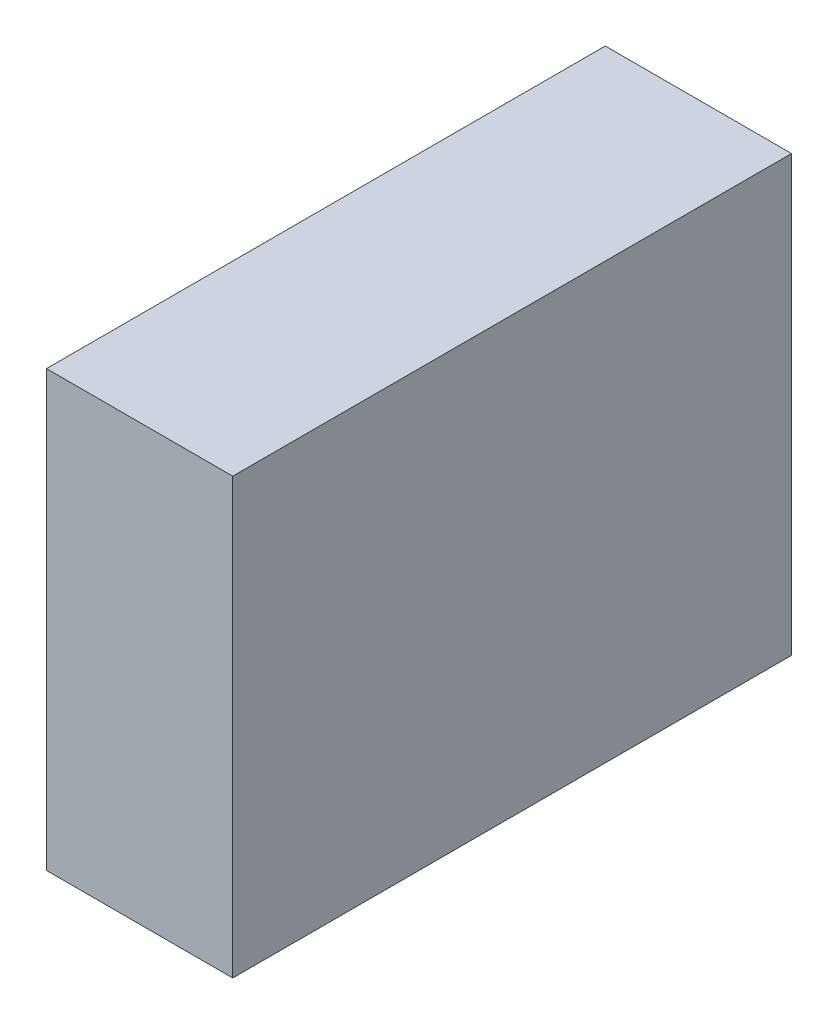
ISO-10303-21;
HEADER;
FILE_DESCRIPTION(('STEP AP214'),'2;1');
FILE_NAME('part.step','',(''),(''),'','','');
FILE_SCHEMA(('AUTOMOTIVE_DESIGN { 1 0 10303 214 1 1 1 1 }'));
ENDSEC;
DATA;
#1=APPLICATION_CONTEXT('core data for automotive mechanical design processes');
#2=APPLICATION_PROTOCOL_DEFINITION('international standard','automotive_design',2000,#1);
#3=PRODUCT_CONTEXT('',#1,'mechanical');
#4=PRODUCT('Part','Part','',(#3));
#5=PRODUCT_RELATED_PRODUCT_CATEGORY('part','',(#4));
#6=PRODUCT_DEFINITION_FORMATION('','',#4);
#7=PRODUCT_DEFINITION_CONTEXT('part definition',#1,'design');
#8=PRODUCT_DEFINITION('design','',#6,#7);
#9=PRODUCT_DEFINITION_SHAPE('','',#8);
#10=(LENGTH_UNIT() NAMED_UNIT(*) SI_UNIT(.MILLI.,.METRE.));
#11=(NAMED_UNIT(*) PLANE_ANGLE_UNIT() SI_UNIT($,.RADIAN.));
#12=(NAMED_UNIT(*) SI_UNIT($,.STERADIAN.) SOLID_ANGLE_UNIT());
#13=UNCERTAINTY_MEASURE_WITH_UNIT(LENGTH_MEASURE(1.E-05),#10,'distance_accuracy_value','');
#14=(GEOMETRIC_REPRESENTATION_CONTEXT(3) GLOBAL_UNCERTAINTY_ASSIGNED_CONTEXT((#13)) GLOBAL_UNIT_ASSIGNED_CONTEXT((#10,
#11,#12)) REPRESENTATION_CONTEXT('',''));
#15=CARTESIAN_POINT('',(0.,0.,0.));
#16=DIRECTION('',(0.,0.,1.));
#17=DIRECTION('',(1.,0.,0.));
#18=AXIS2_PLACEMENT_3D('',#15,#16,#17);
#19=CARTESIAN_POINT('',(950.,490.,90.));
#20=DIRECTION('',(0.,1.,0.));
#21=DIRECTION('',(0.,0.,1.));
#22=AXIS2_PLACEMENT_3D('',#19,#20,#21);
#23=PLANE('',#22);
#24=DIRECTION('',(1.,0.,0.));
#25=VECTOR('',#24,1.);
#26=CARTESIAN_POINT('',(950.,490.,0.));
#27=LINE('',#26,#25);
#28=CARTESIAN_POINT('',(920.,490.,0.));
#29=VERTEX_POINT('',#28);
#30=CARTESIAN_POINT('',(950.,490.,0.));
#31=VERTEX_POINT('',#30);
#32=EDGE_CURVE('E105',#29,#31,#27,.T.);
#33=ORIENTED_EDGE('',*,*,#32,.T.);
#34=DIRECTION('',(0.,0.,-1.));
#35=VECTOR('',#34,1.);
#36=CARTESIAN_POINT('',(950.,490.,90.));
#37=LINE('',#36,#35);
#38=CARTESIAN_POINT('',(950.,490.,90.));
#39=VERTEX_POINT('',#38);
#40=EDGE_CURVE('E11',#39,#31,#37,.T.);
#41=ORIENTED_EDGE('',*,*,#40,.F.);
#42=DIRECTION('',(1.,0.,0.));
#43=VECTOR('',#42,1.);
#44=CARTESIAN_POINT('',(950.,490.,90.));
#45=LINE('',#44,#43);
#46=CARTESIAN_POINT('',(920.,490.,90.));
#47=VERTEX_POINT('',#46);
#48=EDGE_CURVE('E89',#47,#39,#45,.T.);
#49=ORIENTED_EDGE('',*,*,#48,.F.);
#50=DIRECTION('',(0.,0.,-1.));
#51=VECTOR('',#50,1.);
#52=CARTESIAN_POINT('',(920.,490.,90.));
#53=LINE('',#52,#51);
#54=EDGE_CURVE('E97',#47,#29,#53,.T.);
#55=ORIENTED_EDGE('',*,*,#54,.T.);
#56=EDGE_LOOP('',(#33,#41,#49,#55));
#57=FACE_BOUND('',#56,.T.);
#58=ADVANCED_FACE('F39',(#57),#23,.F.);
#59=CARTESIAN_POINT('',(950.,560.,90.));
#60=DIRECTION('',(-1.,0.,0.));
#61=DIRECTION('',(0.,0.,1.));
#62=AXIS2_PLACEMENT_3D('',#59,#60,#61);
#63=PLANE('',#62);
#64=DIRECTION('',(0.,1.,0.));
#65=VECTOR('',#64,1.);
#66=CARTESIAN_POINT('',(950.,560.,0.));
#67=LINE('',#66,#65);
#68=CARTESIAN_POINT('',(950.,560.,0.));
#69=VERTEX_POINT('',#68);
#70=EDGE_CURVE('E92',#31,#69,#67,.T.);
#71=ORIENTED_EDGE('',*,*,#70,.T.);
#72=DIRECTION('',(0.,0.,-1.));
#73=VECTOR('',#72,1.);
#74=CARTESIAN_POINT('',(950.,560.,90.));
#75=LINE('',#74,#73);
#76=CARTESIAN_POINT('',(950.,560.,90.));
#77=VERTEX_POINT('',#76);
#78=EDGE_CURVE('E50',#77,#69,#75,.T.);
#79=ORIENTED_EDGE('',*,*,#78,.F.);
#80=DIRECTION('',(0.,1.,0.));
#81=VECTOR('',#80,1.);
#82=CARTESIAN_POINT('',(950.,560.,90.));
#83=LINE('',#82,#81);
#84=EDGE_CURVE('E82',#39,#77,#83,.T.);
#85=ORIENTED_EDGE('',*,*,#84,.F.);
#86=ORIENTED_EDGE('',*,*,#40,.T.);
#87=EDGE_LOOP('',(#71,#79,#85,#86));
#88=FACE_BOUND('',#87,.T.);
#89=ADVANCED_FACE('F93',(#88),#63,.F.);
#90=CARTESIAN_POINT('',(920.,560.,90.));
#91=DIRECTION('',(0.,-1.,0.));
#92=DIRECTION('',(0.,0.,-1.));
#93=AXIS2_PLACEMENT_3D('',#90,#91,#92);
#94=PLANE('',#93);
#95=DIRECTION('',(-1.,0.,0.));
#96=VECTOR('',#95,1.);
#97=CARTESIAN_POINT('',(920.,560.,0.));
#98=LINE('',#97,#96);
#99=CARTESIAN_POINT('',(920.,560.,0.));
#100=VERTEX_POINT('',#99);
#101=EDGE_CURVE('E72',#69,#100,#98,.T.);
#102=ORIENTED_EDGE('',*,*,#101,.T.);
#103=DIRECTION('',(0.,0.,-1.));
#104=VECTOR('',#103,1.);
#105=CARTESIAN_POINT('',(920.,560.,90.));
#106=LINE('',#105,#104);
#107=CARTESIAN_POINT('',(920.,560.,90.));
#108=VERTEX_POINT('',#107);
#109=EDGE_CURVE('E94',#108,#100,#106,.T.);
#110=ORIENTED_EDGE('',*,*,#109,.F.);
#111=DIRECTION('',(-1.,0.,0.));
#112=VECTOR('',#111,1.);
#113=CARTESIAN_POINT('',(920.,560.,90.));
#114=LINE('',#113,#112);
#115=EDGE_CURVE('E88',#77,#108,#114,.T.);
#116=ORIENTED_EDGE('',*,*,#115,.F.);
#117=ORIENTED_EDGE('',*,*,#78,.T.);
#118=EDGE_LOOP('',(#102,#110,#116,#117));
#119=FACE_BOUND('',#118,.T.);
#120=ADVANCED_FACE('F96',(#119),#94,.F.);
#121=CARTESIAN_POINT('',(920.,490.,90.));
#122=DIRECTION('',(1.,0.,0.));
#123=DIRECTION('',(0.,0.,-1.));
#124=AXIS2_PLACEMENT_3D('',#121,#122,#123);
#125=PLANE('',#124);
#126=DIRECTION('',(0.,-1.,0.));
#127=VECTOR('',#126,1.);
#128=CARTESIAN_POINT('',(920.,490.,0.));
#129=LINE('',#128,#127);
#130=EDGE_CURVE('E76',#100,#29,#129,.T.);
#131=ORIENTED_EDGE('',*,*,#130,.T.);
#132=ORIENTED_EDGE('',*,*,#54,.F.);
#133=DIRECTION('',(0.,-1.,0.));
#134=VECTOR('',#133,1.);
#135=CARTESIAN_POINT('',(920.,490.,90.));
#136=LINE('',#135,#134);
#137=EDGE_CURVE('E54',#108,#47,#136,.T.);
#138=ORIENTED_EDGE('',*,*,#137,.F.);
#139=ORIENTED_EDGE('',*,*,#109,.T.);
#140=EDGE_LOOP('',(#131,#132,#138,#139));
#141=FACE_BOUND('',#140,.T.);
#142=ADVANCED_FACE('F108',(#141),#125,.F.);
#143=CARTESIAN_POINT('',(0.,0.,90.));
#144=DIRECTION('',(0.,0.,-1.));
#145=DIRECTION('',(-1.,0.,0.));
#146=AXIS2_PLACEMENT_3D('',#143,#144,#145);
#147=PLANE('',#146);
#148=ORIENTED_EDGE('',*,*,#48,.T.);
#149=ORIENTED_EDGE('',*,*,#84,.T.);
#150=ORIENTED_EDGE('',*,*,#115,.T.);
#151=ORIENTED_EDGE('',*,*,#137,.T.);
#152=EDGE_LOOP('',(#148,#149,#150,#151));
#153=FACE_BOUND('',#152,.T.);
#154=ADVANCED_FACE('F86',(#153),#147,.F.);
#155=CARTESIAN_POINT('',(0.,0.,0.));
#156=DIRECTION('',(0.,0.,-1.));
#157=DIRECTION('',(-1.,0.,0.));
#158=AXIS2_PLACEMENT_3D('',#155,#156,#157);
#159=PLANE('',#158);
#160=ORIENTED_EDGE('',*,*,#32,.F.);
#161=ORIENTED_EDGE('',*,*,#130,.F.);
#162=ORIENTED_EDGE('',*,*,#101,.F.);
#163=ORIENTED_EDGE('',*,*,#70,.F.);
#164=EDGE_LOOP('',(#160,#161,#162,#163));
#165=FACE_BOUND('',#164,.T.);
#166=ADVANCED_FACE('F115',(#165),#159,.T.);
#167=CLOSED_SHELL('',(#58,#89,#120,#142,#154,#166));
#168=MANIFOLD_SOLID_BREP('B2',#167);
#169=ADVANCED_BREP_SHAPE_REPRESENTATION('',(#18,#168),#14);
#170=SHAPE_DEFINITION_REPRESENTATION(#9,#169);
ENDSEC;
END-ISO-10303-21;
